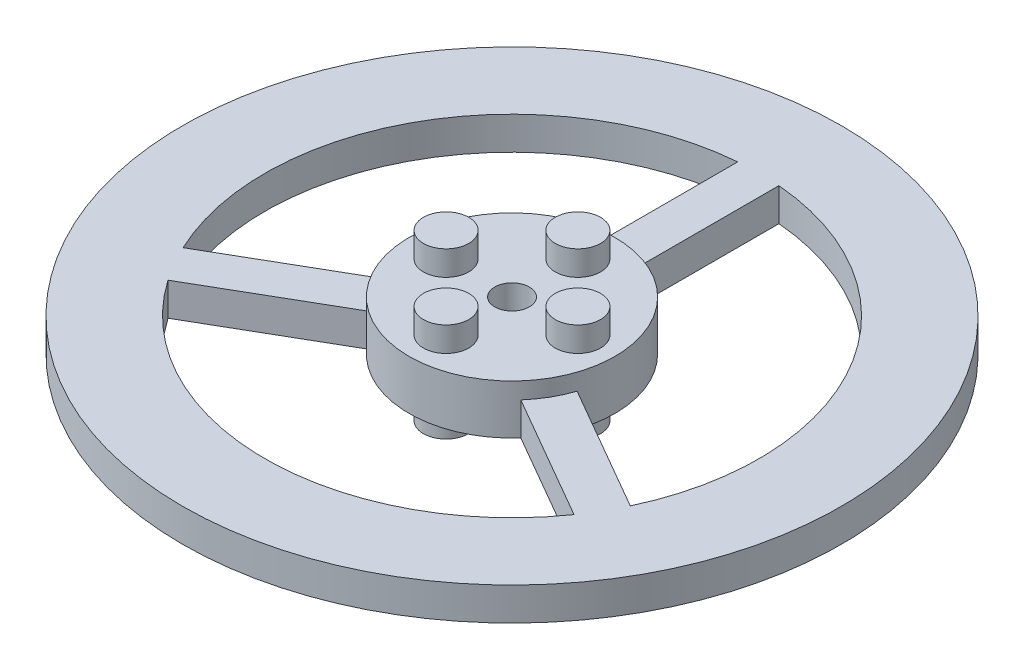
ISO-10303-21;
HEADER;
FILE_DESCRIPTION(('STEP AP214'),'2;1');
FILE_NAME('part.step','',(''),(''),'','','');
FILE_SCHEMA(('AUTOMOTIVE_DESIGN { 1 0 10303 214 1 1 1 1 }'));
ENDSEC;
DATA;
#1=APPLICATION_CONTEXT('core data for automotive mechanical design processes');
#2=APPLICATION_PROTOCOL_DEFINITION('international standard','automotive_design',2000,#1);
#3=PRODUCT_CONTEXT('',#1,'mechanical');
#4=PRODUCT('Part','Part','',(#3));
#5=PRODUCT_RELATED_PRODUCT_CATEGORY('part','',(#4));
#6=PRODUCT_DEFINITION_FORMATION('','',#4);
#7=PRODUCT_DEFINITION_CONTEXT('part definition',#1,'design');
#8=PRODUCT_DEFINITION('design','',#6,#7);
#9=PRODUCT_DEFINITION_SHAPE('','',#8);
#10=(LENGTH_UNIT() NAMED_UNIT(*) SI_UNIT(.MILLI.,.METRE.));
#11=(NAMED_UNIT(*) PLANE_ANGLE_UNIT() SI_UNIT($,.RADIAN.));
#12=(NAMED_UNIT(*) SI_UNIT($,.STERADIAN.) SOLID_ANGLE_UNIT());
#13=UNCERTAINTY_MEASURE_WITH_UNIT(LENGTH_MEASURE(1.E-05),#10,'distance_accuracy_value','');
#14=(GEOMETRIC_REPRESENTATION_CONTEXT(3) GLOBAL_UNCERTAINTY_ASSIGNED_CONTEXT((#13)) GLOBAL_UNIT_ASSIGNED_CONTEXT((#10,
#11,#12)) REPRESENTATION_CONTEXT('',''));
#15=CARTESIAN_POINT('',(0.,0.,0.));
#16=DIRECTION('',(0.,0.,1.));
#17=DIRECTION('',(1.,0.,0.));
#18=AXIS2_PLACEMENT_3D('',#15,#16,#17);
#19=CARTESIAN_POINT('',(0.,4.,0.));
#20=DIRECTION('',(0.,1.,0.));
#21=DIRECTION('',(0.,0.,1.));
#22=AXIS2_PLACEMENT_3D('',#19,#20,#21);
#23=PLANE('',#22);
#24=CARTESIAN_POINT('',(0.,4.,0.));
#25=DIRECTION('',(0.,1.,0.));
#26=DIRECTION('',(0.,0.,1.));
#27=AXIS2_PLACEMENT_3D('',#24,#25,#26);
#28=CIRCLE('',#27,12.5);
#29=CARTESIAN_POINT('',(9.35660171779822,4.,8.28878786641905));
#30=VERTEX_POINT('',#29);
#31=CARTESIAN_POINT('',(11.8566017177982,4.,3.95866084749688));
#32=VERTEX_POINT('',#31);
#33=EDGE_CURVE('E124',#30,#32,#28,.T.);
#34=ORIENTED_EDGE('',*,*,#33,.F.);
#35=DIRECTION('',(-0.866025403784439,0.,-0.5));
#36=VECTOR('',#35,1.);
#37=CARTESIAN_POINT('',(9.35660171779821,4.,8.28878786641904));
#38=LINE('',#37,#36);
#39=CARTESIAN_POINT('',(24.64039397151,4.,17.1128894383378));
#40=VERTEX_POINT('',#39);
#41=EDGE_CURVE('E128',#40,#30,#38,.T.);
#42=ORIENTED_EDGE('',*,*,#41,.F.);
#43=CARTESIAN_POINT('',(0.,4.,0.));
#44=DIRECTION('',(0.,1.,0.));
#45=DIRECTION('',(0.,0.,1.));
#46=AXIS2_PLACEMENT_3D('',#43,#44,#45);
#47=CIRCLE('',#46,30.);
#48=CARTESIAN_POINT('',(-24.64039397151,4.,17.1128894383378));
#49=VERTEX_POINT('',#48);
#50=EDGE_CURVE('E145',#49,#40,#47,.T.);
#51=ORIENTED_EDGE('',*,*,#50,.F.);
#52=DIRECTION('',(-0.866025403784439,0.,0.5));
#53=VECTOR('',#52,1.);
#54=CARTESIAN_POINT('',(-9.35660171779822,4.,8.28878786641904));
#55=LINE('',#54,#53);
#56=CARTESIAN_POINT('',(-9.35660171779822,4.,8.28878786641904));
#57=VERTEX_POINT('',#56);
#58=EDGE_CURVE('E144',#57,#49,#55,.T.);
#59=ORIENTED_EDGE('',*,*,#58,.F.);
#60=CARTESIAN_POINT('',(-11.8566017177982,4.,3.95866084749685));
#61=VERTEX_POINT('',#60);
#62=EDGE_CURVE('E56',#61,#57,#28,.T.);
#63=ORIENTED_EDGE('',*,*,#62,.F.);
#64=DIRECTION('',(0.866025403784439,0.,-0.5));
#65=VECTOR('',#64,1.);
#66=CARTESIAN_POINT('',(-11.8566017177982,4.,3.95866084749685));
#67=LINE('',#66,#65);
#68=CARTESIAN_POINT('',(-27.14039397151,4.,12.7827624194157));
#69=VERTEX_POINT('',#68);
#70=EDGE_CURVE('E163',#69,#61,#67,.T.);
#71=ORIENTED_EDGE('',*,*,#70,.F.);
#72=CARTESIAN_POINT('',(0.,4.,0.));
#73=DIRECTION('',(0.,1.,0.));
#74=DIRECTION('',(0.,0.,1.));
#75=AXIS2_PLACEMENT_3D('',#72,#73,#74);
#76=CIRCLE('',#75,30.);
#77=CARTESIAN_POINT('',(-2.5,4.,-29.8956518577535));
#78=VERTEX_POINT('',#77);
#79=EDGE_CURVE('E161',#78,#69,#76,.T.);
#80=ORIENTED_EDGE('',*,*,#79,.F.);
#81=DIRECTION('',(0.,0.,-1.));
#82=VECTOR('',#81,1.);
#83=CARTESIAN_POINT('',(-2.5,4.,-12.2474487139159));
#84=LINE('',#83,#82);
#85=CARTESIAN_POINT('',(-2.5,4.,-12.2474487139159));
#86=VERTEX_POINT('',#85);
#87=EDGE_CURVE('E167',#86,#78,#84,.T.);
#88=ORIENTED_EDGE('',*,*,#87,.F.);
#89=CARTESIAN_POINT('',(2.5,4.,-12.2474487139159));
#90=VERTEX_POINT('',#89);
#91=EDGE_CURVE('E136',#90,#86,#28,.T.);
#92=ORIENTED_EDGE('',*,*,#91,.F.);
#93=DIRECTION('',(0.,0.,1.));
#94=VECTOR('',#93,1.);
#95=CARTESIAN_POINT('',(2.5,4.,-12.2474487139159));
#96=LINE('',#95,#94);
#97=CARTESIAN_POINT('',(2.5,4.,-29.8956518577535));
#98=VERTEX_POINT('',#97);
#99=EDGE_CURVE('E236',#98,#90,#96,.T.);
#100=ORIENTED_EDGE('',*,*,#99,.F.);
#101=CARTESIAN_POINT('',(0.,4.,0.));
#102=DIRECTION('',(0.,1.,0.));
#103=DIRECTION('',(0.,0.,1.));
#104=AXIS2_PLACEMENT_3D('',#101,#102,#103);
#105=CIRCLE('',#104,30.);
#106=CARTESIAN_POINT('',(27.1403939715099,4.,12.7827624194157));
#107=VERTEX_POINT('',#106);
#108=EDGE_CURVE('E234',#107,#98,#105,.T.);
#109=ORIENTED_EDGE('',*,*,#108,.F.);
#110=DIRECTION('',(0.866025403784437,0.,0.500000000000002));
#111=VECTOR('',#110,1.);
#112=CARTESIAN_POINT('',(11.8566017177982,4.,3.95866084749688));
#113=LINE('',#112,#111);
#114=EDGE_CURVE('E130',#32,#107,#113,.T.);
#115=ORIENTED_EDGE('',*,*,#114,.F.);
#116=EDGE_LOOP('',(#34,#42,#51,#59,#63,#71,#80,#88,#92,#100,#109,#115));
#117=FACE_BOUND('',#116,.T.);
#118=CARTESIAN_POINT('',(0.,4.,0.));
#119=DIRECTION('',(0.,1.,0.));
#120=DIRECTION('',(0.,0.,1.));
#121=AXIS2_PLACEMENT_3D('',#118,#119,#120);
#122=CIRCLE('',#121,40.);
#123=CARTESIAN_POINT('',(0.,4.,40.));
#124=VERTEX_POINT('',#123);
#125=EDGE_CURVE('E190',#124,#124,#122,.T.);
#126=ORIENTED_EDGE('',*,*,#125,.T.);
#127=EDGE_LOOP('',(#126));
#128=FACE_BOUND('',#127,.T.);
#129=ADVANCED_FACE('F33',(#117,#128),#23,.T.);
#130=CARTESIAN_POINT('',(0.,0.,0.));
#131=DIRECTION('',(0.,1.,0.));
#132=DIRECTION('',(0.,0.,1.));
#133=AXIS2_PLACEMENT_3D('',#130,#131,#132);
#134=PLANE('',#133);
#135=CARTESIAN_POINT('',(-8.,0.,0.));
#136=DIRECTION('',(0.,1.,0.));
#137=DIRECTION('',(0.,0.,1.));
#138=AXIS2_PLACEMENT_3D('',#135,#136,#137);
#139=CIRCLE('',#138,2.75);
#140=CARTESIAN_POINT('',(-8.,0.,2.74999999999992));
#141=VERTEX_POINT('',#140);
#142=EDGE_CURVE('E590',#141,#141,#139,.T.);
#143=ORIENTED_EDGE('',*,*,#142,.T.);
#144=EDGE_LOOP('',(#143));
#145=FACE_BOUND('',#144,.T.);
#146=CARTESIAN_POINT('',(2.25414240564596E-13,0.,8.));
#147=DIRECTION('',(0.,1.,0.));
#148=DIRECTION('',(0.,0.,1.));
#149=AXIS2_PLACEMENT_3D('',#146,#147,#148);
#150=CIRCLE('',#149,2.75000000000027);
#151=CARTESIAN_POINT('',(2.25414240564596E-13,0.,10.7500000000003));
#152=VERTEX_POINT('',#151);
#153=EDGE_CURVE('E604',#152,#152,#150,.T.);
#154=ORIENTED_EDGE('',*,*,#153,.T.);
#155=EDGE_LOOP('',(#154));
#156=FACE_BOUND('',#155,.T.);
#157=CARTESIAN_POINT('',(8.,0.,0.));
#158=DIRECTION('',(0.,1.,0.));
#159=DIRECTION('',(0.,0.,1.));
#160=AXIS2_PLACEMENT_3D('',#157,#158,#159);
#161=CIRCLE('',#160,2.75);
#162=CARTESIAN_POINT('',(8.,0.,2.75000000000003));
#163=VERTEX_POINT('',#162);
#164=EDGE_CURVE('E613',#163,#163,#161,.T.);
#165=ORIENTED_EDGE('',*,*,#164,.T.);
#166=EDGE_LOOP('',(#165));
#167=FACE_BOUND('',#166,.T.);
#168=CARTESIAN_POINT('',(0.,0.,-8.));
#169=DIRECTION('',(0.,1.,0.));
#170=DIRECTION('',(0.,0.,1.));
#171=AXIS2_PLACEMENT_3D('',#168,#169,#170);
#172=CIRCLE('',#171,2.75);
#173=CARTESIAN_POINT('',(0.,0.,-5.25));
#174=VERTEX_POINT('',#173);
#175=EDGE_CURVE('E223',#174,#174,#172,.T.);
#176=ORIENTED_EDGE('',*,*,#175,.T.);
#177=EDGE_LOOP('',(#176));
#178=FACE_BOUND('',#177,.T.);
#179=CARTESIAN_POINT('',(0.,0.,0.));
#180=DIRECTION('',(0.,1.,0.));
#181=DIRECTION('',(0.,0.,1.));
#182=AXIS2_PLACEMENT_3D('',#179,#180,#181);
#183=CIRCLE('',#182,2.1);
#184=CARTESIAN_POINT('',(0.,0.,2.1));
#185=VERTEX_POINT('',#184);
#186=EDGE_CURVE('E230',#185,#185,#183,.T.);
#187=ORIENTED_EDGE('',*,*,#186,.T.);
#188=EDGE_LOOP('',(#187));
#189=FACE_BOUND('',#188,.T.);
#190=CARTESIAN_POINT('',(0.,0.,0.));
#191=DIRECTION('',(0.,1.,0.));
#192=DIRECTION('',(0.,0.,1.));
#193=AXIS2_PLACEMENT_3D('',#190,#191,#192);
#194=CIRCLE('',#193,30.);
#195=CARTESIAN_POINT('',(-24.64039397151,0.,17.1128894383378));
#196=VERTEX_POINT('',#195);
#197=CARTESIAN_POINT('',(24.64039397151,0.,17.1128894383378));
#198=VERTEX_POINT('',#197);
#199=EDGE_CURVE('E258',#196,#198,#194,.T.);
#200=ORIENTED_EDGE('',*,*,#199,.T.);
#201=DIRECTION('',(-0.866025403784439,0.,-0.5));
#202=VECTOR('',#201,1.);
#203=CARTESIAN_POINT('',(9.35660171779821,0.,8.28878786641904));
#204=LINE('',#203,#202);
#205=CARTESIAN_POINT('',(9.35660171779821,0.,8.28878786641904));
#206=VERTEX_POINT('',#205);
#207=EDGE_CURVE('E264',#198,#206,#204,.T.);
#208=ORIENTED_EDGE('',*,*,#207,.T.);
#209=CARTESIAN_POINT('',(0.,0.,0.));
#210=DIRECTION('',(0.,-1.,0.));
#211=DIRECTION('',(0.,0.,1.));
#212=AXIS2_PLACEMENT_3D('',#209,#210,#211);
#213=CIRCLE('',#212,12.5);
#214=CARTESIAN_POINT('',(-9.35660171779822,0.,8.28878786641904));
#215=VERTEX_POINT('',#214);
#216=EDGE_CURVE('E151',#206,#215,#213,.T.);
#217=ORIENTED_EDGE('',*,*,#216,.T.);
#218=DIRECTION('',(-0.866025403784439,0.,0.5));
#219=VECTOR('',#218,1.);
#220=CARTESIAN_POINT('',(-9.35660171779822,0.,8.28878786641904));
#221=LINE('',#220,#219);
#222=EDGE_CURVE('E259',#215,#196,#221,.T.);
#223=ORIENTED_EDGE('',*,*,#222,.T.);
#224=EDGE_LOOP('',(#200,#208,#217,#223));
#225=FACE_BOUND('',#224,.T.);
#226=CARTESIAN_POINT('',(0.,0.,0.));
#227=DIRECTION('',(0.,1.,0.));
#228=DIRECTION('',(0.,0.,1.));
#229=AXIS2_PLACEMENT_3D('',#226,#227,#228);
#230=CIRCLE('',#229,40.);
#231=CARTESIAN_POINT('',(0.,0.,40.));
#232=VERTEX_POINT('',#231);
#233=EDGE_CURVE('E189',#232,#232,#230,.T.);
#234=ORIENTED_EDGE('',*,*,#233,.F.);
#235=EDGE_LOOP('',(#234));
#236=FACE_BOUND('',#235,.T.);
#237=CARTESIAN_POINT('',(0.,0.,0.));
#238=DIRECTION('',(0.,1.,0.));
#239=DIRECTION('',(0.,0.,1.));
#240=AXIS2_PLACEMENT_3D('',#237,#238,#239);
#241=CIRCLE('',#240,30.);
#242=CARTESIAN_POINT('',(-2.5,0.,-29.8956518577535));
#243=VERTEX_POINT('',#242);
#244=CARTESIAN_POINT('',(-27.14039397151,0.,12.7827624194157));
#245=VERTEX_POINT('',#244);
#246=EDGE_CURVE('E155',#243,#245,#241,.T.);
#247=ORIENTED_EDGE('',*,*,#246,.T.);
#248=DIRECTION('',(0.866025403784439,0.,-0.5));
#249=VECTOR('',#248,1.);
#250=CARTESIAN_POINT('',(-11.8566017177982,0.,3.95866084749685));
#251=LINE('',#250,#249);
#252=CARTESIAN_POINT('',(-11.8566017177982,0.,3.95866084749685));
#253=VERTEX_POINT('',#252);
#254=EDGE_CURVE('E172',#245,#253,#251,.T.);
#255=ORIENTED_EDGE('',*,*,#254,.T.);
#256=CARTESIAN_POINT('',(0.,0.,0.));
#257=DIRECTION('',(0.,-1.,0.));
#258=DIRECTION('',(0.,0.,1.));
#259=AXIS2_PLACEMENT_3D('',#256,#257,#258);
#260=CIRCLE('',#259,12.5);
#261=CARTESIAN_POINT('',(-2.5,0.,-12.2474487139159));
#262=VERTEX_POINT('',#261);
#263=EDGE_CURVE('E175',#253,#262,#260,.T.);
#264=ORIENTED_EDGE('',*,*,#263,.T.);
#265=DIRECTION('',(0.,0.,-1.));
#266=VECTOR('',#265,1.);
#267=CARTESIAN_POINT('',(-2.5,0.,-12.2474487139159));
#268=LINE('',#267,#266);
#269=EDGE_CURVE('E164',#262,#243,#268,.T.);
#270=ORIENTED_EDGE('',*,*,#269,.T.);
#271=EDGE_LOOP('',(#247,#255,#264,#270));
#272=FACE_BOUND('',#271,.T.);
#273=CARTESIAN_POINT('',(0.,0.,0.));
#274=DIRECTION('',(0.,1.,0.));
#275=DIRECTION('',(0.,0.,1.));
#276=AXIS2_PLACEMENT_3D('',#273,#274,#275);
#277=CIRCLE('',#276,30.);
#278=CARTESIAN_POINT('',(27.1403939715099,0.,12.7827624194157));
#279=VERTEX_POINT('',#278);
#280=CARTESIAN_POINT('',(2.5,0.,-29.8956518577535));
#281=VERTEX_POINT('',#280);
#282=EDGE_CURVE('E48',#279,#281,#277,.T.);
#283=ORIENTED_EDGE('',*,*,#282,.T.);
#284=DIRECTION('',(0.,0.,1.));
#285=VECTOR('',#284,1.);
#286=CARTESIAN_POINT('',(2.5,0.,-12.2474487139159));
#287=LINE('',#286,#285);
#288=CARTESIAN_POINT('',(2.5,0.,-12.2474487139159));
#289=VERTEX_POINT('',#288);
#290=EDGE_CURVE('E243',#281,#289,#287,.T.);
#291=ORIENTED_EDGE('',*,*,#290,.T.);
#292=CARTESIAN_POINT('',(0.,0.,0.));
#293=DIRECTION('',(0.,-1.,0.));
#294=DIRECTION('',(0.,0.,1.));
#295=AXIS2_PLACEMENT_3D('',#292,#293,#294);
#296=CIRCLE('',#295,12.5);
#297=CARTESIAN_POINT('',(11.8566017177982,0.,3.95866084749688));
#298=VERTEX_POINT('',#297);
#299=EDGE_CURVE('E246',#289,#298,#296,.T.);
#300=ORIENTED_EDGE('',*,*,#299,.T.);
#301=DIRECTION('',(0.866025403784437,0.,0.500000000000002));
#302=VECTOR('',#301,1.);
#303=CARTESIAN_POINT('',(11.8566017177982,0.,3.95866084749688));
#304=LINE('',#303,#302);
#305=EDGE_CURVE('E237',#298,#279,#304,.T.);
#306=ORIENTED_EDGE('',*,*,#305,.T.);
#307=EDGE_LOOP('',(#283,#291,#300,#306));
#308=FACE_BOUND('',#307,.T.);
#309=ADVANCED_FACE('F276',(#145,#156,#167,#178,#189,#225,#236,#272,#308),#134,.F.);
#310=CARTESIAN_POINT('',(0.,4.,0.));
#311=DIRECTION('',(0.,-1.,0.));
#312=DIRECTION('',(0.,0.,-1.));
#313=AXIS2_PLACEMENT_3D('',#310,#311,#312);
#314=CYLINDRICAL_SURFACE('',#313,40.);
#315=ORIENTED_EDGE('',*,*,#125,.F.);
#316=EDGE_LOOP('',(#315));
#317=FACE_BOUND('',#316,.T.);
#318=ORIENTED_EDGE('',*,*,#233,.T.);
#319=EDGE_LOOP('',(#318));
#320=FACE_BOUND('',#319,.T.);
#321=ADVANCED_FACE('F35',(#317,#320),#314,.T.);
#322=CARTESIAN_POINT('',(0.,4.,0.));
#323=DIRECTION('',(0.,-1.,0.));
#324=DIRECTION('',(0.,0.,-1.));
#325=AXIS2_PLACEMENT_3D('',#322,#323,#324);
#326=CYLINDRICAL_SURFACE('',#325,30.);
#327=ORIENTED_EDGE('',*,*,#246,.F.);
#328=DIRECTION('',(0.,-1.,0.));
#329=VECTOR('',#328,1.);
#330=CARTESIAN_POINT('',(-2.5,4.,-29.8956518577535));
#331=LINE('',#330,#329);
#332=EDGE_CURVE('E169',#78,#243,#331,.T.);
#333=ORIENTED_EDGE('',*,*,#332,.F.);
#334=ORIENTED_EDGE('',*,*,#79,.T.);
#335=DIRECTION('',(0.,-1.,0.));
#336=VECTOR('',#335,1.);
#337=CARTESIAN_POINT('',(-27.14039397151,4.,12.7827624194157));
#338=LINE('',#337,#336);
#339=EDGE_CURVE('E186',#69,#245,#338,.T.);
#340=ORIENTED_EDGE('',*,*,#339,.T.);
#341=EDGE_LOOP('',(#327,#333,#334,#340));
#342=FACE_BOUND('',#341,.T.);
#343=ADVANCED_FACE('F289',(#342),#326,.F.);
#344=CARTESIAN_POINT('',(-11.8566017177982,4.,3.95866084749685));
#345=DIRECTION('',(-0.5,0.,-0.866025403784439));
#346=DIRECTION('',(-0.866025403784439,0.,0.5));
#347=AXIS2_PLACEMENT_3D('',#344,#345,#346);
#348=PLANE('',#347);
#349=ORIENTED_EDGE('',*,*,#254,.F.);
#350=ORIENTED_EDGE('',*,*,#339,.F.);
#351=ORIENTED_EDGE('',*,*,#70,.T.);
#352=DIRECTION('',(0.,-1.,0.));
#353=VECTOR('',#352,1.);
#354=CARTESIAN_POINT('',(-11.8566017177982,4.,3.95866084749685));
#355=LINE('',#354,#353);
#356=EDGE_CURVE('E184',#61,#253,#355,.T.);
#357=ORIENTED_EDGE('',*,*,#356,.T.);
#358=EDGE_LOOP('',(#349,#350,#351,#357));
#359=FACE_BOUND('',#358,.T.);
#360=ADVANCED_FACE('F283',(#359),#348,.T.);
#361=CARTESIAN_POINT('',(0.,4.,0.));
#362=DIRECTION('',(0.,-1.,0.));
#363=DIRECTION('',(0.,0.,-1.));
#364=AXIS2_PLACEMENT_3D('',#361,#362,#363);
#365=CYLINDRICAL_SURFACE('',#364,12.5);
#366=ORIENTED_EDGE('',*,*,#263,.F.);
#367=ORIENTED_EDGE('',*,*,#356,.F.);
#368=ORIENTED_EDGE('',*,*,#62,.T.);
#369=DIRECTION('',(0.,-1.,0.));
#370=VECTOR('',#369,1.);
#371=CARTESIAN_POINT('',(-9.35660171779822,4.,8.28878786641904));
#372=LINE('',#371,#370);
#373=EDGE_CURVE('E153',#57,#215,#372,.T.);
#374=ORIENTED_EDGE('',*,*,#373,.T.);
#375=ORIENTED_EDGE('',*,*,#216,.F.);
#376=DIRECTION('',(0.,-1.,0.));
#377=VECTOR('',#376,1.);
#378=CARTESIAN_POINT('',(9.35660171779821,4.,8.28878786641904));
#379=LINE('',#378,#377);
#380=EDGE_CURVE('E140',#30,#206,#379,.T.);
#381=ORIENTED_EDGE('',*,*,#380,.F.);
#382=ORIENTED_EDGE('',*,*,#33,.T.);
#383=DIRECTION('',(0.,-1.,0.));
#384=VECTOR('',#383,1.);
#385=CARTESIAN_POINT('',(11.8566017177982,4.,3.95866084749688));
#386=LINE('',#385,#384);
#387=EDGE_CURVE('E252',#32,#298,#386,.T.);
#388=ORIENTED_EDGE('',*,*,#387,.T.);
#389=ORIENTED_EDGE('',*,*,#299,.F.);
#390=DIRECTION('',(0.,-1.,0.));
#391=VECTOR('',#390,1.);
#392=CARTESIAN_POINT('',(2.5,4.,-12.2474487139159));
#393=LINE('',#392,#391);
#394=EDGE_CURVE('E254',#90,#289,#393,.T.);
#395=ORIENTED_EDGE('',*,*,#394,.F.);
#396=ORIENTED_EDGE('',*,*,#91,.T.);
#397=DIRECTION('',(0.,-1.,0.));
#398=VECTOR('',#397,1.);
#399=CARTESIAN_POINT('',(-2.5,4.,-12.2474487139159));
#400=LINE('',#399,#398);
#401=EDGE_CURVE('E182',#86,#262,#400,.T.);
#402=ORIENTED_EDGE('',*,*,#401,.T.);
#403=EDGE_LOOP('',(#366,#367,#368,#374,#375,#381,#382,#388,#389,#395,#396,#402));
#404=FACE_BOUND('',#403,.T.);
#405=CARTESIAN_POINT('',(0.,6.,0.));
#406=DIRECTION('',(0.,1.,0.));
#407=DIRECTION('',(0.,0.,1.));
#408=AXIS2_PLACEMENT_3D('',#405,#406,#407);
#409=CIRCLE('',#408,12.5);
#410=CARTESIAN_POINT('',(0.,6.,12.5));
#411=VERTEX_POINT('',#410);
#412=EDGE_CURVE('E133',#411,#411,#409,.T.);
#413=ORIENTED_EDGE('',*,*,#412,.F.);
#414=EDGE_LOOP('',(#413));
#415=FACE_BOUND('',#414,.T.);
#416=ADVANCED_FACE('F148',(#404,#415),#365,.T.);
#417=CARTESIAN_POINT('',(-2.5,4.,-12.2474487139159));
#418=DIRECTION('',(-1.,0.,0.));
#419=DIRECTION('',(0.,0.,1.));
#420=AXIS2_PLACEMENT_3D('',#417,#418,#419);
#421=PLANE('',#420);
#422=ORIENTED_EDGE('',*,*,#269,.F.);
#423=ORIENTED_EDGE('',*,*,#401,.F.);
#424=ORIENTED_EDGE('',*,*,#87,.T.);
#425=ORIENTED_EDGE('',*,*,#332,.T.);
#426=EDGE_LOOP('',(#422,#423,#424,#425));
#427=FACE_BOUND('',#426,.T.);
#428=ADVANCED_FACE('F294',(#427),#421,.T.);
#429=CARTESIAN_POINT('',(0.,4.,0.));
#430=DIRECTION('',(0.,-1.,0.));
#431=DIRECTION('',(0.,0.,-1.));
#432=AXIS2_PLACEMENT_3D('',#429,#430,#431);
#433=CYLINDRICAL_SURFACE('',#432,30.);
#434=ORIENTED_EDGE('',*,*,#199,.F.);
#435=DIRECTION('',(0.,-1.,0.));
#436=VECTOR('',#435,1.);
#437=CARTESIAN_POINT('',(-24.64039397151,4.,17.1128894383378));
#438=LINE('',#437,#436);
#439=EDGE_CURVE('E157',#49,#196,#438,.T.);
#440=ORIENTED_EDGE('',*,*,#439,.F.);
#441=ORIENTED_EDGE('',*,*,#50,.T.);
#442=DIRECTION('',(0.,-1.,0.));
#443=VECTOR('',#442,1.);
#444=CARTESIAN_POINT('',(24.64039397151,4.,17.1128894383378));
#445=LINE('',#444,#443);
#446=EDGE_CURVE('E143',#40,#198,#445,.T.);
#447=ORIENTED_EDGE('',*,*,#446,.T.);
#448=EDGE_LOOP('',(#434,#440,#441,#447));
#449=FACE_BOUND('',#448,.T.);
#450=ADVANCED_FACE('F278',(#449),#433,.F.);
#451=CARTESIAN_POINT('',(9.35660171779821,4.,8.28878786641904));
#452=DIRECTION('',(-0.5,0.,0.866025403784439));
#453=DIRECTION('',(0.866025403784439,0.,0.5));
#454=AXIS2_PLACEMENT_3D('',#451,#452,#453);
#455=PLANE('',#454);
#456=ORIENTED_EDGE('',*,*,#207,.F.);
#457=ORIENTED_EDGE('',*,*,#446,.F.);
#458=ORIENTED_EDGE('',*,*,#41,.T.);
#459=ORIENTED_EDGE('',*,*,#380,.T.);
#460=EDGE_LOOP('',(#456,#457,#458,#459));
#461=FACE_BOUND('',#460,.T.);
#462=ADVANCED_FACE('F139',(#461),#455,.T.);
#463=CARTESIAN_POINT('',(-9.35660171779822,4.,8.28878786641904));
#464=DIRECTION('',(0.5,0.,0.866025403784439));
#465=DIRECTION('',(0.866025403784439,0.,-0.5));
#466=AXIS2_PLACEMENT_3D('',#463,#464,#465);
#467=PLANE('',#466);
#468=ORIENTED_EDGE('',*,*,#222,.F.);
#469=ORIENTED_EDGE('',*,*,#373,.F.);
#470=ORIENTED_EDGE('',*,*,#58,.T.);
#471=ORIENTED_EDGE('',*,*,#439,.T.);
#472=EDGE_LOOP('',(#468,#469,#470,#471));
#473=FACE_BOUND('',#472,.T.);
#474=ADVANCED_FACE('F272',(#473),#467,.T.);
#475=CARTESIAN_POINT('',(0.,4.,0.));
#476=DIRECTION('',(0.,-1.,0.));
#477=DIRECTION('',(0.,0.,-1.));
#478=AXIS2_PLACEMENT_3D('',#475,#476,#477);
#479=CYLINDRICAL_SURFACE('',#478,30.);
#480=ORIENTED_EDGE('',*,*,#282,.F.);
#481=DIRECTION('',(0.,-1.,0.));
#482=VECTOR('',#481,1.);
#483=CARTESIAN_POINT('',(27.1403939715099,4.,12.7827624194157));
#484=LINE('',#483,#482);
#485=EDGE_CURVE('E241',#107,#279,#484,.T.);
#486=ORIENTED_EDGE('',*,*,#485,.F.);
#487=ORIENTED_EDGE('',*,*,#108,.T.);
#488=DIRECTION('',(0.,-1.,0.));
#489=VECTOR('',#488,1.);
#490=CARTESIAN_POINT('',(2.5,4.,-29.8956518577535));
#491=LINE('',#490,#489);
#492=EDGE_CURVE('E256',#98,#281,#491,.T.);
#493=ORIENTED_EDGE('',*,*,#492,.T.);
#494=EDGE_LOOP('',(#480,#486,#487,#493));
#495=FACE_BOUND('',#494,.T.);
#496=ADVANCED_FACE('F347',(#495),#479,.F.);
#497=CARTESIAN_POINT('',(2.5,4.,-12.2474487139159));
#498=DIRECTION('',(1.,0.,0.));
#499=DIRECTION('',(0.,0.,-1.));
#500=AXIS2_PLACEMENT_3D('',#497,#498,#499);
#501=PLANE('',#500);
#502=ORIENTED_EDGE('',*,*,#290,.F.);
#503=ORIENTED_EDGE('',*,*,#492,.F.);
#504=ORIENTED_EDGE('',*,*,#99,.T.);
#505=ORIENTED_EDGE('',*,*,#394,.T.);
#506=EDGE_LOOP('',(#502,#503,#504,#505));
#507=FACE_BOUND('',#506,.T.);
#508=ADVANCED_FACE('F354',(#507),#501,.T.);
#509=CARTESIAN_POINT('',(11.8566017177982,4.,3.95866084749688));
#510=DIRECTION('',(0.500000000000002,0.,-0.866025403784437));
#511=DIRECTION('',(-0.866025403784437,0.,-0.500000000000002));
#512=AXIS2_PLACEMENT_3D('',#509,#510,#511);
#513=PLANE('',#512);
#514=ORIENTED_EDGE('',*,*,#305,.F.);
#515=ORIENTED_EDGE('',*,*,#387,.F.);
#516=ORIENTED_EDGE('',*,*,#114,.T.);
#517=ORIENTED_EDGE('',*,*,#485,.T.);
#518=EDGE_LOOP('',(#514,#515,#516,#517));
#519=FACE_BOUND('',#518,.T.);
#520=ADVANCED_FACE('F359',(#519),#513,.T.);
#521=CARTESIAN_POINT('',(0.,0.,0.));
#522=DIRECTION('',(0.,1.,0.));
#523=DIRECTION('',(0.,0.,1.));
#524=AXIS2_PLACEMENT_3D('',#521,#522,#523);
#525=CYLINDRICAL_SURFACE('',#524,2.1);
#526=ORIENTED_EDGE('',*,*,#186,.F.);
#527=EDGE_LOOP('',(#526));
#528=FACE_BOUND('',#527,.T.);
#529=CARTESIAN_POINT('',(0.,6.,0.));
#530=DIRECTION('',(0.,1.,0.));
#531=DIRECTION('',(0.,0.,1.));
#532=AXIS2_PLACEMENT_3D('',#529,#530,#531);
#533=CIRCLE('',#532,2.1);
#534=CARTESIAN_POINT('',(0.,6.,2.1));
#535=VERTEX_POINT('',#534);
#536=EDGE_CURVE('E134',#535,#535,#533,.T.);
#537=ORIENTED_EDGE('',*,*,#536,.T.);
#538=EDGE_LOOP('',(#537));
#539=FACE_BOUND('',#538,.T.);
#540=ADVANCED_FACE('F210',(#528,#539),#525,.F.);
#541=CARTESIAN_POINT('',(0.,6.,0.));
#542=DIRECTION('',(0.,1.,0.));
#543=DIRECTION('',(0.,0.,1.));
#544=AXIS2_PLACEMENT_3D('',#541,#542,#543);
#545=PLANE('',#544);
#546=CARTESIAN_POINT('',(-8.,6.,0.));
#547=DIRECTION('',(0.,1.,0.));
#548=DIRECTION('',(0.,0.,1.));
#549=AXIS2_PLACEMENT_3D('',#546,#547,#548);
#550=CIRCLE('',#549,2.75);
#551=CARTESIAN_POINT('',(-8.,6.,2.74999999999992));
#552=VERTEX_POINT('',#551);
#553=EDGE_CURVE('E11',#552,#552,#550,.T.);
#554=ORIENTED_EDGE('',*,*,#553,.F.);
#555=EDGE_LOOP('',(#554));
#556=FACE_BOUND('',#555,.T.);
#557=CARTESIAN_POINT('',(2.25414240564596E-13,6.,8.));
#558=DIRECTION('',(0.,1.,0.));
#559=DIRECTION('',(0.,0.,1.));
#560=AXIS2_PLACEMENT_3D('',#557,#558,#559);
#561=CIRCLE('',#560,2.75000000000027);
#562=CARTESIAN_POINT('',(2.25414240564596E-13,6.,10.7500000000003));
#563=VERTEX_POINT('',#562);
#564=EDGE_CURVE('E41',#563,#563,#561,.T.);
#565=ORIENTED_EDGE('',*,*,#564,.F.);
#566=EDGE_LOOP('',(#565));
#567=FACE_BOUND('',#566,.T.);
#568=CARTESIAN_POINT('',(8.,6.,0.));
#569=DIRECTION('',(0.,1.,0.));
#570=DIRECTION('',(0.,0.,1.));
#571=AXIS2_PLACEMENT_3D('',#568,#569,#570);
#572=CIRCLE('',#571,2.75);
#573=CARTESIAN_POINT('',(8.,6.,2.75000000000003));
#574=VERTEX_POINT('',#573);
#575=EDGE_CURVE('E198',#574,#574,#572,.T.);
#576=ORIENTED_EDGE('',*,*,#575,.F.);
#577=EDGE_LOOP('',(#576));
#578=FACE_BOUND('',#577,.T.);
#579=CARTESIAN_POINT('',(0.,6.,-8.));
#580=DIRECTION('',(0.,1.,0.));
#581=DIRECTION('',(0.,0.,1.));
#582=AXIS2_PLACEMENT_3D('',#579,#580,#581);
#583=CIRCLE('',#582,2.75);
#584=CARTESIAN_POINT('',(0.,6.,-5.25));
#585=VERTEX_POINT('',#584);
#586=EDGE_CURVE('E195',#585,#585,#583,.T.);
#587=ORIENTED_EDGE('',*,*,#586,.F.);
#588=EDGE_LOOP('',(#587));
#589=FACE_BOUND('',#588,.T.);
#590=ORIENTED_EDGE('',*,*,#412,.T.);
#591=EDGE_LOOP('',(#590));
#592=FACE_BOUND('',#591,.T.);
#593=ORIENTED_EDGE('',*,*,#536,.F.);
#594=EDGE_LOOP('',(#593));
#595=FACE_BOUND('',#594,.T.);
#596=ADVANCED_FACE('F206',(#556,#567,#578,#589,#592,#595),#545,.T.);
#597=CARTESIAN_POINT('',(0.,9.,-8.));
#598=DIRECTION('',(0.,1.,0.));
#599=DIRECTION('',(0.,0.,1.));
#600=AXIS2_PLACEMENT_3D('',#597,#598,#599);
#601=PLANE('',#600);
#602=CARTESIAN_POINT('',(0.,9.,-8.));
#603=DIRECTION('',(0.,1.,0.));
#604=DIRECTION('',(0.,0.,1.));
#605=AXIS2_PLACEMENT_3D('',#602,#603,#604);
#606=CIRCLE('',#605,2.75);
#607=CARTESIAN_POINT('',(0.,9.,-5.25));
#608=VERTEX_POINT('',#607);
#609=EDGE_CURVE('E616',#608,#608,#606,.T.);
#610=ORIENTED_EDGE('',*,*,#609,.T.);
#611=EDGE_LOOP('',(#610));
#612=FACE_BOUND('',#611,.T.);
#613=ADVANCED_FACE('F209',(#612),#601,.T.);
#614=CARTESIAN_POINT('',(0.,-3.,-8.));
#615=DIRECTION('',(0.,1.,0.));
#616=DIRECTION('',(0.,0.,1.));
#617=AXIS2_PLACEMENT_3D('',#614,#615,#616);
#618=CYLINDRICAL_SURFACE('',#617,2.75);
#619=ORIENTED_EDGE('',*,*,#586,.T.);
#620=EDGE_LOOP('',(#619));
#621=FACE_BOUND('',#620,.T.);
#622=ORIENTED_EDGE('',*,*,#609,.F.);
#623=EDGE_LOOP('',(#622));
#624=FACE_BOUND('',#623,.T.);
#625=ADVANCED_FACE('F401',(#621,#624),#618,.T.);
#626=CARTESIAN_POINT('',(0.,-3.,-8.));
#627=DIRECTION('',(0.,1.,0.));
#628=DIRECTION('',(0.,0.,1.));
#629=AXIS2_PLACEMENT_3D('',#626,#627,#628);
#630=CIRCLE('',#629,2.75);
#631=CARTESIAN_POINT('',(0.,-3.,-5.25));
#632=VERTEX_POINT('',#631);
#633=EDGE_CURVE('E226',#632,#632,#630,.T.);
#634=ORIENTED_EDGE('',*,*,#633,.T.);
#635=EDGE_LOOP('',(#634));
#636=FACE_BOUND('',#635,.T.);
#637=ORIENTED_EDGE('',*,*,#175,.F.);
#638=EDGE_LOOP('',(#637));
#639=FACE_BOUND('',#638,.T.);
#640=ADVANCED_FACE('F411',(#636,#639),#618,.T.);
#641=CARTESIAN_POINT('',(0.,-3.,-8.));
#642=DIRECTION('',(0.,1.,0.));
#643=DIRECTION('',(0.,0.,1.));
#644=AXIS2_PLACEMENT_3D('',#641,#642,#643);
#645=PLANE('',#644);
#646=ORIENTED_EDGE('',*,*,#633,.F.);
#647=EDGE_LOOP('',(#646));
#648=FACE_BOUND('',#647,.T.);
#649=ADVANCED_FACE('F421',(#648),#645,.F.);
#650=CARTESIAN_POINT('',(8.,9.,0.));
#651=DIRECTION('',(0.,1.,0.));
#652=DIRECTION('',(0.,0.,1.));
#653=AXIS2_PLACEMENT_3D('',#650,#651,#652);
#654=PLANE('',#653);
#655=CARTESIAN_POINT('',(8.,9.,0.));
#656=DIRECTION('',(0.,1.,0.));
#657=DIRECTION('',(0.,0.,1.));
#658=AXIS2_PLACEMENT_3D('',#655,#656,#657);
#659=CIRCLE('',#658,2.75);
#660=CARTESIAN_POINT('',(8.,9.,2.75000000000003));
#661=VERTEX_POINT('',#660);
#662=EDGE_CURVE('E607',#661,#661,#659,.T.);
#663=ORIENTED_EDGE('',*,*,#662,.T.);
#664=EDGE_LOOP('',(#663));
#665=FACE_BOUND('',#664,.T.);
#666=ADVANCED_FACE('F430',(#665),#654,.T.);
#667=CARTESIAN_POINT('',(8.,-3.,0.));
#668=DIRECTION('',(0.,1.,0.));
#669=DIRECTION('',(0.,0.,1.));
#670=AXIS2_PLACEMENT_3D('',#667,#668,#669);
#671=CYLINDRICAL_SURFACE('',#670,2.75);
#672=ORIENTED_EDGE('',*,*,#575,.T.);
#673=EDGE_LOOP('',(#672));
#674=FACE_BOUND('',#673,.T.);
#675=ORIENTED_EDGE('',*,*,#662,.F.);
#676=EDGE_LOOP('',(#675));
#677=FACE_BOUND('',#676,.T.);
#678=ADVANCED_FACE('F440',(#674,#677),#671,.T.);
#679=CARTESIAN_POINT('',(8.,-3.,0.));
#680=DIRECTION('',(0.,1.,0.));
#681=DIRECTION('',(0.,0.,1.));
#682=AXIS2_PLACEMENT_3D('',#679,#680,#681);
#683=CIRCLE('',#682,2.75);
#684=CARTESIAN_POINT('',(8.,-3.,2.75000000000003));
#685=VERTEX_POINT('',#684);
#686=EDGE_CURVE('E610',#685,#685,#683,.T.);
#687=ORIENTED_EDGE('',*,*,#686,.T.);
#688=EDGE_LOOP('',(#687));
#689=FACE_BOUND('',#688,.T.);
#690=ORIENTED_EDGE('',*,*,#164,.F.);
#691=EDGE_LOOP('',(#690));
#692=FACE_BOUND('',#691,.T.);
#693=ADVANCED_FACE('F450',(#689,#692),#671,.T.);
#694=CARTESIAN_POINT('',(8.,-3.,0.));
#695=DIRECTION('',(0.,1.,0.));
#696=DIRECTION('',(0.,0.,1.));
#697=AXIS2_PLACEMENT_3D('',#694,#695,#696);
#698=PLANE('',#697);
#699=ORIENTED_EDGE('',*,*,#686,.F.);
#700=EDGE_LOOP('',(#699));
#701=FACE_BOUND('',#700,.T.);
#702=ADVANCED_FACE('F460',(#701),#698,.F.);
#703=CARTESIAN_POINT('',(2.25414240564596E-13,9.,8.));
#704=DIRECTION('',(0.,1.,0.));
#705=DIRECTION('',(0.,0.,1.));
#706=AXIS2_PLACEMENT_3D('',#703,#704,#705);
#707=PLANE('',#706);
#708=CARTESIAN_POINT('',(2.25414240564596E-13,9.,8.));
#709=DIRECTION('',(0.,1.,0.));
#710=DIRECTION('',(0.,0.,1.));
#711=AXIS2_PLACEMENT_3D('',#708,#709,#710);
#712=CIRCLE('',#711,2.75000000000027);
#713=CARTESIAN_POINT('',(2.25414240564596E-13,9.,10.7500000000003));
#714=VERTEX_POINT('',#713);
#715=EDGE_CURVE('E594',#714,#714,#712,.T.);
#716=ORIENTED_EDGE('',*,*,#715,.T.);
#717=EDGE_LOOP('',(#716));
#718=FACE_BOUND('',#717,.T.);
#719=ADVANCED_FACE('F469',(#718),#707,.T.);
#720=CARTESIAN_POINT('',(2.25414240564596E-13,-3.,8.));
#721=DIRECTION('',(0.,1.,0.));
#722=DIRECTION('',(0.,0.,1.));
#723=AXIS2_PLACEMENT_3D('',#720,#721,#722);
#724=CYLINDRICAL_SURFACE('',#723,2.75000000000027);
#725=ORIENTED_EDGE('',*,*,#564,.T.);
#726=EDGE_LOOP('',(#725));
#727=FACE_BOUND('',#726,.T.);
#728=ORIENTED_EDGE('',*,*,#715,.F.);
#729=EDGE_LOOP('',(#728));
#730=FACE_BOUND('',#729,.T.);
#731=ADVANCED_FACE('F203',(#727,#730),#724,.T.);
#732=CARTESIAN_POINT('',(2.25414240564596E-13,-3.,8.));
#733=DIRECTION('',(0.,1.,0.));
#734=DIRECTION('',(0.,0.,1.));
#735=AXIS2_PLACEMENT_3D('',#732,#733,#734);
#736=CIRCLE('',#735,2.75000000000027);
#737=CARTESIAN_POINT('',(2.25414240564596E-13,-3.,10.7500000000003));
#738=VERTEX_POINT('',#737);
#739=EDGE_CURVE('E601',#738,#738,#736,.T.);
#740=ORIENTED_EDGE('',*,*,#739,.T.);
#741=EDGE_LOOP('',(#740));
#742=FACE_BOUND('',#741,.T.);
#743=ORIENTED_EDGE('',*,*,#153,.F.);
#744=EDGE_LOOP('',(#743));
#745=FACE_BOUND('',#744,.T.);
#746=ADVANCED_FACE('F488',(#742,#745),#724,.T.);
#747=CARTESIAN_POINT('',(2.25414240564596E-13,-3.,8.));
#748=DIRECTION('',(0.,1.,0.));
#749=DIRECTION('',(0.,0.,1.));
#750=AXIS2_PLACEMENT_3D('',#747,#748,#749);
#751=PLANE('',#750);
#752=ORIENTED_EDGE('',*,*,#739,.F.);
#753=EDGE_LOOP('',(#752));
#754=FACE_BOUND('',#753,.T.);
#755=ADVANCED_FACE('F497',(#754),#751,.F.);
#756=CARTESIAN_POINT('',(-8.,9.,0.));
#757=DIRECTION('',(0.,1.,0.));
#758=DIRECTION('',(0.,0.,1.));
#759=AXIS2_PLACEMENT_3D('',#756,#757,#758);
#760=PLANE('',#759);
#761=CARTESIAN_POINT('',(-8.,9.,0.));
#762=DIRECTION('',(0.,1.,0.));
#763=DIRECTION('',(0.,0.,1.));
#764=AXIS2_PLACEMENT_3D('',#761,#762,#763);
#765=CIRCLE('',#764,2.75);
#766=CARTESIAN_POINT('',(-8.,9.,2.74999999999992));
#767=VERTEX_POINT('',#766);
#768=EDGE_CURVE('E591',#767,#767,#765,.T.);
#769=ORIENTED_EDGE('',*,*,#768,.T.);
#770=EDGE_LOOP('',(#769));
#771=FACE_BOUND('',#770,.T.);
#772=ADVANCED_FACE('F506',(#771),#760,.T.);
#773=CARTESIAN_POINT('',(-8.,-3.,0.));
#774=DIRECTION('',(0.,1.,0.));
#775=DIRECTION('',(0.,0.,1.));
#776=AXIS2_PLACEMENT_3D('',#773,#774,#775);
#777=CYLINDRICAL_SURFACE('',#776,2.75);
#778=ORIENTED_EDGE('',*,*,#553,.T.);
#779=EDGE_LOOP('',(#778));
#780=FACE_BOUND('',#779,.T.);
#781=ORIENTED_EDGE('',*,*,#768,.F.);
#782=EDGE_LOOP('',(#781));
#783=FACE_BOUND('',#782,.T.);
#784=ADVANCED_FACE('F516',(#780,#783),#777,.T.);
#785=CARTESIAN_POINT('',(-8.,-3.,0.));
#786=DIRECTION('',(0.,1.,0.));
#787=DIRECTION('',(0.,0.,1.));
#788=AXIS2_PLACEMENT_3D('',#785,#786,#787);
#789=CIRCLE('',#788,2.75);
#790=CARTESIAN_POINT('',(-8.,-3.,2.74999999999992));
#791=VERTEX_POINT('',#790);
#792=EDGE_CURVE('E589',#791,#791,#789,.T.);
#793=ORIENTED_EDGE('',*,*,#792,.T.);
#794=EDGE_LOOP('',(#793));
#795=FACE_BOUND('',#794,.T.);
#796=ORIENTED_EDGE('',*,*,#142,.F.);
#797=EDGE_LOOP('',(#796));
#798=FACE_BOUND('',#797,.T.);
#799=ADVANCED_FACE('F526',(#795,#798),#777,.T.);
#800=CARTESIAN_POINT('',(-8.,-3.,0.));
#801=DIRECTION('',(0.,1.,0.));
#802=DIRECTION('',(0.,0.,1.));
#803=AXIS2_PLACEMENT_3D('',#800,#801,#802);
#804=PLANE('',#803);
#805=ORIENTED_EDGE('',*,*,#792,.F.);
#806=EDGE_LOOP('',(#805));
#807=FACE_BOUND('',#806,.T.);
#808=ADVANCED_FACE('F536',(#807),#804,.F.);
#809=CLOSED_SHELL('',(#129,#309,#321,#343,#360,#416,#428,#450,#462,#474,#496,#508,#520,#540,
#596,#613,#625,#640,#649,#666,#678,#693,#702,#719,#731,#746,#755,#772,#784,#799,#808));
#810=MANIFOLD_SOLID_BREP('B2',#809);
#811=ADVANCED_BREP_SHAPE_REPRESENTATION('',(#18,#810),#14);
#812=SHAPE_DEFINITION_REPRESENTATION(#9,#811);
ENDSEC;
END-ISO-10303-21;
